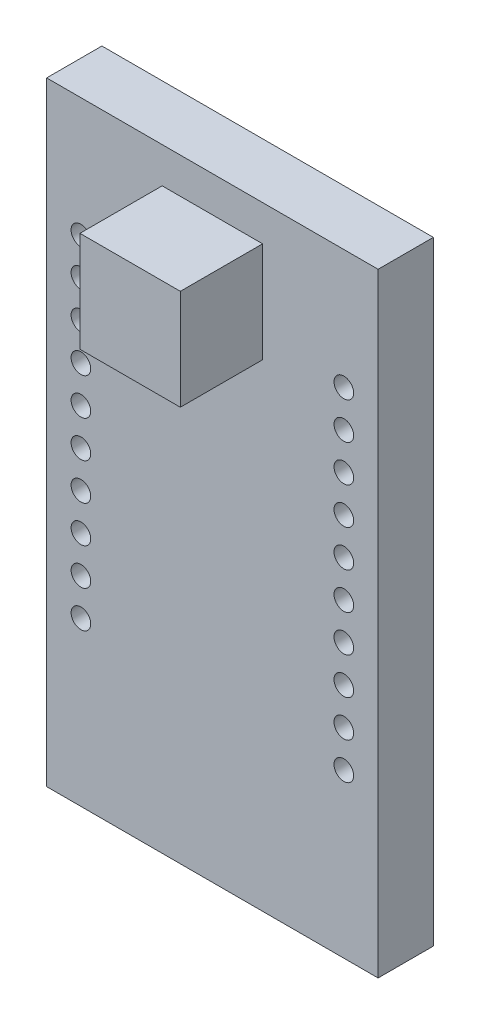
ISO-10303-21;
HEADER;
FILE_DESCRIPTION(('STEP AP214'),'2;1');
FILE_NAME('part.step','',(''),(''),'','','');
FILE_SCHEMA(('AUTOMOTIVE_DESIGN { 1 0 10303 214 1 1 1 1 }'));
ENDSEC;
DATA;
#1=APPLICATION_CONTEXT('core data for automotive mechanical design processes');
#2=APPLICATION_PROTOCOL_DEFINITION('international standard','automotive_design',2000,#1);
#3=PRODUCT_CONTEXT('',#1,'mechanical');
#4=PRODUCT('Part','Part','',(#3));
#5=PRODUCT_RELATED_PRODUCT_CATEGORY('part','',(#4));
#6=PRODUCT_DEFINITION_FORMATION('','',#4);
#7=PRODUCT_DEFINITION_CONTEXT('part definition',#1,'design');
#8=PRODUCT_DEFINITION('design','',#6,#7);
#9=PRODUCT_DEFINITION_SHAPE('','',#8);
#10=(LENGTH_UNIT() NAMED_UNIT(*) SI_UNIT(.MILLI.,.METRE.));
#11=(NAMED_UNIT(*) PLANE_ANGLE_UNIT() SI_UNIT($,.RADIAN.));
#12=(NAMED_UNIT(*) SI_UNIT($,.STERADIAN.) SOLID_ANGLE_UNIT());
#13=UNCERTAINTY_MEASURE_WITH_UNIT(LENGTH_MEASURE(1.E-05),#10,'distance_accuracy_value','');
#14=(GEOMETRIC_REPRESENTATION_CONTEXT(3) GLOBAL_UNCERTAINTY_ASSIGNED_CONTEXT((#13)) GLOBAL_UNIT_ASSIGNED_CONTEXT((#10,
#11,#12)) REPRESENTATION_CONTEXT('',''));
#15=CARTESIAN_POINT('',(0.,0.,0.));
#16=DIRECTION('',(0.,0.,1.));
#17=DIRECTION('',(1.,0.,0.));
#18=AXIS2_PLACEMENT_3D('',#15,#16,#17);
#19=CARTESIAN_POINT('',(0.,0.,4.5));
#20=DIRECTION('',(0.,0.,1.));
#21=DIRECTION('',(1.,0.,0.));
#22=AXIS2_PLACEMENT_3D('',#19,#20,#21);
#23=PLANE('',#22);
#24=CARTESIAN_POINT('',(-10.7092898997726,15.2710613434894,4.5));
#25=DIRECTION('',(0.,0.,-1.));
#26=DIRECTION('',(-1.,0.,0.));
#27=AXIS2_PLACEMENT_3D('',#24,#25,#26);
#28=CIRCLE('',#27,0.800000000000001);
#29=CARTESIAN_POINT('',(-11.5092898997726,15.2710613434894,4.5));
#30=VERTEX_POINT('',#29);
#31=EDGE_CURVE('E228',#30,#30,#28,.T.);
#32=ORIENTED_EDGE('',*,*,#31,.T.);
#33=EDGE_LOOP('',(#32));
#34=FACE_BOUND('',#33,.T.);
#35=CARTESIAN_POINT('',(-10.7092898997726,12.2710613434894,4.5));
#36=DIRECTION('',(0.,0.,-1.));
#37=DIRECTION('',(-1.,0.,0.));
#38=AXIS2_PLACEMENT_3D('',#35,#36,#37);
#39=CIRCLE('',#38,0.800000000000001);
#40=CARTESIAN_POINT('',(-11.5092898997726,12.2710613434894,4.5));
#41=VERTEX_POINT('',#40);
#42=EDGE_CURVE('E358',#41,#41,#39,.T.);
#43=ORIENTED_EDGE('',*,*,#42,.T.);
#44=EDGE_LOOP('',(#43));
#45=FACE_BOUND('',#44,.T.);
#46=CARTESIAN_POINT('',(-10.7092898997726,9.27106134348941,4.5));
#47=DIRECTION('',(0.,0.,-1.));
#48=DIRECTION('',(-1.,0.,0.));
#49=AXIS2_PLACEMENT_3D('',#46,#47,#48);
#50=CIRCLE('',#49,0.800000000000001);
#51=CARTESIAN_POINT('',(-11.5092898997726,9.27106134348941,4.5));
#52=VERTEX_POINT('',#51);
#53=EDGE_CURVE('E354',#52,#52,#50,.T.);
#54=ORIENTED_EDGE('',*,*,#53,.T.);
#55=EDGE_LOOP('',(#54));
#56=FACE_BOUND('',#55,.T.);
#57=CARTESIAN_POINT('',(-10.7092898997726,6.27106134348941,4.5));
#58=DIRECTION('',(0.,0.,-1.));
#59=DIRECTION('',(-1.,0.,0.));
#60=AXIS2_PLACEMENT_3D('',#57,#58,#59);
#61=CIRCLE('',#60,0.800000000000001);
#62=CARTESIAN_POINT('',(-11.5092898997726,6.27106134348941,4.5));
#63=VERTEX_POINT('',#62);
#64=EDGE_CURVE('E350',#63,#63,#61,.T.);
#65=ORIENTED_EDGE('',*,*,#64,.T.);
#66=EDGE_LOOP('',(#65));
#67=FACE_BOUND('',#66,.T.);
#68=CARTESIAN_POINT('',(-10.7092898997726,3.27106134348941,4.5));
#69=DIRECTION('',(0.,0.,-1.));
#70=DIRECTION('',(-1.,0.,0.));
#71=AXIS2_PLACEMENT_3D('',#68,#69,#70);
#72=CIRCLE('',#71,0.800000000000001);
#73=CARTESIAN_POINT('',(-11.5092898997726,3.27106134348941,4.5));
#74=VERTEX_POINT('',#73);
#75=EDGE_CURVE('E346',#74,#74,#72,.T.);
#76=ORIENTED_EDGE('',*,*,#75,.T.);
#77=EDGE_LOOP('',(#76));
#78=FACE_BOUND('',#77,.T.);
#79=CARTESIAN_POINT('',(-10.7092898997726,0.27106134348941,4.5));
#80=DIRECTION('',(0.,0.,-1.));
#81=DIRECTION('',(-1.,0.,0.));
#82=AXIS2_PLACEMENT_3D('',#79,#80,#81);
#83=CIRCLE('',#82,0.800000000000001);
#84=CARTESIAN_POINT('',(-11.5092898997726,0.27106134348941,4.5));
#85=VERTEX_POINT('',#84);
#86=EDGE_CURVE('E342',#85,#85,#83,.T.);
#87=ORIENTED_EDGE('',*,*,#86,.T.);
#88=EDGE_LOOP('',(#87));
#89=FACE_BOUND('',#88,.T.);
#90=CARTESIAN_POINT('',(-10.7092898997726,-2.72893865651059,4.5));
#91=DIRECTION('',(0.,0.,-1.));
#92=DIRECTION('',(-1.,0.,0.));
#93=AXIS2_PLACEMENT_3D('',#90,#91,#92);
#94=CIRCLE('',#93,0.800000000000001);
#95=CARTESIAN_POINT('',(-11.5092898997726,-2.72893865651059,4.5));
#96=VERTEX_POINT('',#95);
#97=EDGE_CURVE('E338',#96,#96,#94,.T.);
#98=ORIENTED_EDGE('',*,*,#97,.T.);
#99=EDGE_LOOP('',(#98));
#100=FACE_BOUND('',#99,.T.);
#101=CARTESIAN_POINT('',(-10.7092898997726,-5.72893865651059,4.5));
#102=DIRECTION('',(0.,0.,-1.));
#103=DIRECTION('',(-1.,0.,0.));
#104=AXIS2_PLACEMENT_3D('',#101,#102,#103);
#105=CIRCLE('',#104,0.800000000000001);
#106=CARTESIAN_POINT('',(-11.5092898997726,-5.72893865651059,4.5));
#107=VERTEX_POINT('',#106);
#108=EDGE_CURVE('E334',#107,#107,#105,.T.);
#109=ORIENTED_EDGE('',*,*,#108,.T.);
#110=EDGE_LOOP('',(#109));
#111=FACE_BOUND('',#110,.T.);
#112=CARTESIAN_POINT('',(-10.7092898997726,-8.72893865651059,4.5));
#113=DIRECTION('',(0.,0.,-1.));
#114=DIRECTION('',(-1.,0.,0.));
#115=AXIS2_PLACEMENT_3D('',#112,#113,#114);
#116=CIRCLE('',#115,0.800000000000001);
#117=CARTESIAN_POINT('',(-11.5092898997726,-8.72893865651059,4.5));
#118=VERTEX_POINT('',#117);
#119=EDGE_CURVE('E330',#118,#118,#116,.T.);
#120=ORIENTED_EDGE('',*,*,#119,.T.);
#121=EDGE_LOOP('',(#120));
#122=FACE_BOUND('',#121,.T.);
#123=CARTESIAN_POINT('',(-10.7092898997726,-11.7289386565106,4.5));
#124=DIRECTION('',(0.,0.,-1.));
#125=DIRECTION('',(-1.,0.,0.));
#126=AXIS2_PLACEMENT_3D('',#123,#124,#125);
#127=CIRCLE('',#126,0.800000000000001);
#128=CARTESIAN_POINT('',(-11.5092898997726,-11.7289386565106,4.5));
#129=VERTEX_POINT('',#128);
#130=EDGE_CURVE('E326',#129,#129,#127,.T.);
#131=ORIENTED_EDGE('',*,*,#130,.T.);
#132=EDGE_LOOP('',(#131));
#133=FACE_BOUND('',#132,.T.);
#134=CARTESIAN_POINT('',(10.7092898997726,15.2710613434894,4.5));
#135=DIRECTION('',(0.,0.,1.));
#136=DIRECTION('',(1.,0.,0.));
#137=AXIS2_PLACEMENT_3D('',#134,#135,#136);
#138=CIRCLE('',#137,0.800000000000001);
#139=CARTESIAN_POINT('',(11.5092898997726,15.2710613434894,4.5));
#140=VERTEX_POINT('',#139);
#141=EDGE_CURVE('E187',#140,#140,#138,.T.);
#142=ORIENTED_EDGE('',*,*,#141,.F.);
#143=EDGE_LOOP('',(#142));
#144=FACE_BOUND('',#143,.T.);
#145=CARTESIAN_POINT('',(10.7092898997726,12.2710613434894,4.5));
#146=DIRECTION('',(0.,0.,1.));
#147=DIRECTION('',(1.,0.,0.));
#148=AXIS2_PLACEMENT_3D('',#145,#146,#147);
#149=CIRCLE('',#148,0.800000000000001);
#150=CARTESIAN_POINT('',(11.5092898997726,12.2710613434894,4.5));
#151=VERTEX_POINT('',#150);
#152=EDGE_CURVE('E297',#151,#151,#149,.T.);
#153=ORIENTED_EDGE('',*,*,#152,.F.);
#154=EDGE_LOOP('',(#153));
#155=FACE_BOUND('',#154,.T.);
#156=CARTESIAN_POINT('',(10.7092898997726,9.27106134348941,4.5));
#157=DIRECTION('',(0.,0.,1.));
#158=DIRECTION('',(1.,0.,0.));
#159=AXIS2_PLACEMENT_3D('',#156,#157,#158);
#160=CIRCLE('',#159,0.800000000000001);
#161=CARTESIAN_POINT('',(11.5092898997726,9.27106134348941,4.5));
#162=VERTEX_POINT('',#161);
#163=EDGE_CURVE('E301',#162,#162,#160,.T.);
#164=ORIENTED_EDGE('',*,*,#163,.F.);
#165=EDGE_LOOP('',(#164));
#166=FACE_BOUND('',#165,.T.);
#167=CARTESIAN_POINT('',(10.7092898997726,6.27106134348941,4.5));
#168=DIRECTION('',(0.,0.,1.));
#169=DIRECTION('',(1.,0.,0.));
#170=AXIS2_PLACEMENT_3D('',#167,#168,#169);
#171=CIRCLE('',#170,0.800000000000001);
#172=CARTESIAN_POINT('',(11.5092898997726,6.27106134348941,4.5));
#173=VERTEX_POINT('',#172);
#174=EDGE_CURVE('E305',#173,#173,#171,.T.);
#175=ORIENTED_EDGE('',*,*,#174,.F.);
#176=EDGE_LOOP('',(#175));
#177=FACE_BOUND('',#176,.T.);
#178=CARTESIAN_POINT('',(10.7092898997726,3.27106134348941,4.5));
#179=DIRECTION('',(0.,0.,1.));
#180=DIRECTION('',(1.,0.,0.));
#181=AXIS2_PLACEMENT_3D('',#178,#179,#180);
#182=CIRCLE('',#181,0.800000000000001);
#183=CARTESIAN_POINT('',(11.5092898997726,3.27106134348941,4.5));
#184=VERTEX_POINT('',#183);
#185=EDGE_CURVE('E309',#184,#184,#182,.T.);
#186=ORIENTED_EDGE('',*,*,#185,.F.);
#187=EDGE_LOOP('',(#186));
#188=FACE_BOUND('',#187,.T.);
#189=CARTESIAN_POINT('',(10.7092898997726,0.27106134348941,4.5));
#190=DIRECTION('',(0.,0.,1.));
#191=DIRECTION('',(1.,0.,0.));
#192=AXIS2_PLACEMENT_3D('',#189,#190,#191);
#193=CIRCLE('',#192,0.800000000000001);
#194=CARTESIAN_POINT('',(11.5092898997726,0.27106134348941,4.5));
#195=VERTEX_POINT('',#194);
#196=EDGE_CURVE('E313',#195,#195,#193,.T.);
#197=ORIENTED_EDGE('',*,*,#196,.F.);
#198=EDGE_LOOP('',(#197));
#199=FACE_BOUND('',#198,.T.);
#200=CARTESIAN_POINT('',(10.7092898997726,-2.72893865651059,4.5));
#201=DIRECTION('',(0.,0.,1.));
#202=DIRECTION('',(1.,0.,0.));
#203=AXIS2_PLACEMENT_3D('',#200,#201,#202);
#204=CIRCLE('',#203,0.800000000000001);
#205=CARTESIAN_POINT('',(11.5092898997726,-2.72893865651059,4.5));
#206=VERTEX_POINT('',#205);
#207=EDGE_CURVE('E317',#206,#206,#204,.T.);
#208=ORIENTED_EDGE('',*,*,#207,.F.);
#209=EDGE_LOOP('',(#208));
#210=FACE_BOUND('',#209,.T.);
#211=CARTESIAN_POINT('',(10.7092898997726,-5.72893865651059,4.5));
#212=DIRECTION('',(0.,0.,1.));
#213=DIRECTION('',(1.,0.,0.));
#214=AXIS2_PLACEMENT_3D('',#211,#212,#213);
#215=CIRCLE('',#214,0.800000000000001);
#216=CARTESIAN_POINT('',(11.5092898997726,-5.72893865651059,4.5));
#217=VERTEX_POINT('',#216);
#218=EDGE_CURVE('E273',#217,#217,#215,.T.);
#219=ORIENTED_EDGE('',*,*,#218,.F.);
#220=EDGE_LOOP('',(#219));
#221=FACE_BOUND('',#220,.T.);
#222=CARTESIAN_POINT('',(10.7092898997726,-8.72893865651059,4.5));
#223=DIRECTION('',(0.,0.,1.));
#224=DIRECTION('',(1.,0.,0.));
#225=AXIS2_PLACEMENT_3D('',#222,#223,#224);
#226=CIRCLE('',#225,0.800000000000001);
#227=CARTESIAN_POINT('',(11.5092898997726,-8.72893865651059,4.5));
#228=VERTEX_POINT('',#227);
#229=EDGE_CURVE('E267',#228,#228,#226,.T.);
#230=ORIENTED_EDGE('',*,*,#229,.F.);
#231=EDGE_LOOP('',(#230));
#232=FACE_BOUND('',#231,.T.);
#233=CARTESIAN_POINT('',(10.7092898997726,-11.7289386565106,4.5));
#234=DIRECTION('',(0.,0.,1.));
#235=DIRECTION('',(1.,0.,0.));
#236=AXIS2_PLACEMENT_3D('',#233,#234,#235);
#237=CIRCLE('',#236,0.800000000000001);
#238=CARTESIAN_POINT('',(11.5092898997726,-11.7289386565106,4.5));
#239=VERTEX_POINT('',#238);
#240=EDGE_CURVE('E262',#239,#239,#237,.T.);
#241=ORIENTED_EDGE('',*,*,#240,.F.);
#242=EDGE_LOOP('',(#241));
#243=FACE_BOUND('',#242,.T.);
#244=DIRECTION('',(0.,1.,0.));
#245=VECTOR('',#244,1.);
#246=CARTESIAN_POINT('',(13.5,25.,4.5));
#247=LINE('',#246,#245);
#248=CARTESIAN_POINT('',(13.5,-25.,4.5));
#249=VERTEX_POINT('',#248);
#250=CARTESIAN_POINT('',(13.5,25.,4.5));
#251=VERTEX_POINT('',#250);
#252=EDGE_CURVE('E156',#249,#251,#247,.T.);
#253=ORIENTED_EDGE('',*,*,#252,.T.);
#254=DIRECTION('',(-1.,0.,0.));
#255=VECTOR('',#254,1.);
#256=CARTESIAN_POINT('',(-13.5,25.,4.5));
#257=LINE('',#256,#255);
#258=CARTESIAN_POINT('',(-13.5,25.,4.5));
#259=VERTEX_POINT('',#258);
#260=EDGE_CURVE('E96',#251,#259,#257,.T.);
#261=ORIENTED_EDGE('',*,*,#260,.T.);
#262=DIRECTION('',(0.,-1.,0.));
#263=VECTOR('',#262,1.);
#264=CARTESIAN_POINT('',(-13.5,25.,4.5));
#265=LINE('',#264,#263);
#266=CARTESIAN_POINT('',(-13.5,-25.,4.5));
#267=VERTEX_POINT('',#266);
#268=EDGE_CURVE('E161',#259,#267,#265,.T.);
#269=ORIENTED_EDGE('',*,*,#268,.T.);
#270=DIRECTION('',(1.,0.,0.));
#271=VECTOR('',#270,1.);
#272=CARTESIAN_POINT('',(-13.5,-25.,4.5));
#273=LINE('',#272,#271);
#274=EDGE_CURVE('E68',#267,#249,#273,.T.);
#275=ORIENTED_EDGE('',*,*,#274,.T.);
#276=EDGE_LOOP('',(#253,#261,#269,#275));
#277=FACE_BOUND('',#276,.T.);
#278=DIRECTION('',(-1.,0.,0.));
#279=VECTOR('',#278,1.);
#280=CARTESIAN_POINT('',(-4.09,22.09,4.5));
#281=LINE('',#280,#279);
#282=CARTESIAN_POINT('',(4.09,22.09,4.5));
#283=VERTEX_POINT('',#282);
#284=CARTESIAN_POINT('',(-4.09,22.09,4.5));
#285=VERTEX_POINT('',#284);
#286=EDGE_CURVE('E284',#283,#285,#281,.T.);
#287=ORIENTED_EDGE('',*,*,#286,.F.);
#288=DIRECTION('',(0.,1.,0.));
#289=VECTOR('',#288,1.);
#290=CARTESIAN_POINT('',(4.09,22.09,4.5));
#291=LINE('',#290,#289);
#292=CARTESIAN_POINT('',(4.09,13.91,4.5));
#293=VERTEX_POINT('',#292);
#294=EDGE_CURVE('E143',#293,#283,#291,.T.);
#295=ORIENTED_EDGE('',*,*,#294,.F.);
#296=DIRECTION('',(1.,0.,0.));
#297=VECTOR('',#296,1.);
#298=CARTESIAN_POINT('',(-4.09,13.91,4.5));
#299=LINE('',#298,#297);
#300=CARTESIAN_POINT('',(-4.09,13.91,4.5));
#301=VERTEX_POINT('',#300);
#302=EDGE_CURVE('E139',#301,#293,#299,.T.);
#303=ORIENTED_EDGE('',*,*,#302,.F.);
#304=DIRECTION('',(0.,-1.,0.));
#305=VECTOR('',#304,1.);
#306=CARTESIAN_POINT('',(-4.09,22.09,4.5));
#307=LINE('',#306,#305);
#308=EDGE_CURVE('E287',#285,#301,#307,.T.);
#309=ORIENTED_EDGE('',*,*,#308,.F.);
#310=EDGE_LOOP('',(#287,#295,#303,#309));
#311=FACE_BOUND('',#310,.T.);
#312=ADVANCED_FACE('F41',(#34,#45,#56,#67,#78,#89,#100,#111,#122,#133,#144,#155,#166,#177,#188,
#199,#210,#221,#232,#243,#277,#311),#23,.T.);
#313=CARTESIAN_POINT('',(13.5,25.,4.5));
#314=DIRECTION('',(-1.,0.,0.));
#315=DIRECTION('',(0.,-1.,0.));
#316=AXIS2_PLACEMENT_3D('',#313,#314,#315);
#317=PLANE('',#316);
#318=DIRECTION('',(0.,1.,0.));
#319=VECTOR('',#318,1.);
#320=CARTESIAN_POINT('',(13.5,25.,0.));
#321=LINE('',#320,#319);
#322=CARTESIAN_POINT('',(13.5,-25.,0.));
#323=VERTEX_POINT('',#322);
#324=CARTESIAN_POINT('',(13.5,25.,0.));
#325=VERTEX_POINT('',#324);
#326=EDGE_CURVE('E146',#323,#325,#321,.T.);
#327=ORIENTED_EDGE('',*,*,#326,.T.);
#328=DIRECTION('',(0.,0.,-1.));
#329=VECTOR('',#328,1.);
#330=CARTESIAN_POINT('',(13.5,25.,4.5));
#331=LINE('',#330,#329);
#332=EDGE_CURVE('E11',#251,#325,#331,.T.);
#333=ORIENTED_EDGE('',*,*,#332,.F.);
#334=ORIENTED_EDGE('',*,*,#252,.F.);
#335=DIRECTION('',(0.,0.,-1.));
#336=VECTOR('',#335,1.);
#337=CARTESIAN_POINT('',(13.5,-25.,4.5));
#338=LINE('',#337,#336);
#339=EDGE_CURVE('E165',#249,#323,#338,.T.);
#340=ORIENTED_EDGE('',*,*,#339,.T.);
#341=EDGE_LOOP('',(#327,#333,#334,#340));
#342=FACE_BOUND('',#341,.T.);
#343=ADVANCED_FACE('F43',(#342),#317,.F.);
#344=CARTESIAN_POINT('',(-13.5,25.,4.5));
#345=DIRECTION('',(0.,-1.,0.));
#346=DIRECTION('',(0.,0.,-1.));
#347=AXIS2_PLACEMENT_3D('',#344,#345,#346);
#348=PLANE('',#347);
#349=DIRECTION('',(-1.,0.,0.));
#350=VECTOR('',#349,1.);
#351=CARTESIAN_POINT('',(-13.5,25.,0.));
#352=LINE('',#351,#350);
#353=CARTESIAN_POINT('',(-13.5,25.,0.));
#354=VERTEX_POINT('',#353);
#355=EDGE_CURVE('E151',#325,#354,#352,.T.);
#356=ORIENTED_EDGE('',*,*,#355,.T.);
#357=DIRECTION('',(0.,0.,-1.));
#358=VECTOR('',#357,1.);
#359=CARTESIAN_POINT('',(-13.5,25.,4.5));
#360=LINE('',#359,#358);
#361=EDGE_CURVE('E51',#259,#354,#360,.T.);
#362=ORIENTED_EDGE('',*,*,#361,.F.);
#363=ORIENTED_EDGE('',*,*,#260,.F.);
#364=ORIENTED_EDGE('',*,*,#332,.T.);
#365=EDGE_LOOP('',(#356,#362,#363,#364));
#366=FACE_BOUND('',#365,.T.);
#367=ADVANCED_FACE('F383',(#366),#348,.F.);
#368=CARTESIAN_POINT('',(-13.5,25.,4.5));
#369=DIRECTION('',(1.,0.,0.));
#370=DIRECTION('',(0.,0.,-1.));
#371=AXIS2_PLACEMENT_3D('',#368,#369,#370);
#372=PLANE('',#371);
#373=DIRECTION('',(0.,-1.,0.));
#374=VECTOR('',#373,1.);
#375=CARTESIAN_POINT('',(-13.5,25.,0.));
#376=LINE('',#375,#374);
#377=CARTESIAN_POINT('',(-13.5,-25.,0.));
#378=VERTEX_POINT('',#377);
#379=EDGE_CURVE('E169',#354,#378,#376,.T.);
#380=ORIENTED_EDGE('',*,*,#379,.T.);
#381=DIRECTION('',(0.,0.,-1.));
#382=VECTOR('',#381,1.);
#383=CARTESIAN_POINT('',(-13.5,-25.,4.5));
#384=LINE('',#383,#382);
#385=EDGE_CURVE('E176',#267,#378,#384,.T.);
#386=ORIENTED_EDGE('',*,*,#385,.F.);
#387=ORIENTED_EDGE('',*,*,#268,.F.);
#388=ORIENTED_EDGE('',*,*,#361,.T.);
#389=EDGE_LOOP('',(#380,#386,#387,#388));
#390=FACE_BOUND('',#389,.T.);
#391=ADVANCED_FACE('F395',(#390),#372,.F.);
#392=CARTESIAN_POINT('',(-13.5,-25.,4.5));
#393=DIRECTION('',(0.,1.,0.));
#394=DIRECTION('',(0.,0.,1.));
#395=AXIS2_PLACEMENT_3D('',#392,#393,#394);
#396=PLANE('',#395);
#397=DIRECTION('',(1.,0.,0.));
#398=VECTOR('',#397,1.);
#399=CARTESIAN_POINT('',(-13.5,-25.,0.));
#400=LINE('',#399,#398);
#401=EDGE_CURVE('E89',#378,#323,#400,.T.);
#402=ORIENTED_EDGE('',*,*,#401,.T.);
#403=ORIENTED_EDGE('',*,*,#339,.F.);
#404=ORIENTED_EDGE('',*,*,#274,.F.);
#405=ORIENTED_EDGE('',*,*,#385,.T.);
#406=EDGE_LOOP('',(#402,#403,#404,#405));
#407=FACE_BOUND('',#406,.T.);
#408=ADVANCED_FACE('F391',(#407),#396,.F.);
#409=CARTESIAN_POINT('',(0.,0.,0.));
#410=DIRECTION('',(0.,0.,1.));
#411=DIRECTION('',(1.,0.,0.));
#412=AXIS2_PLACEMENT_3D('',#409,#410,#411);
#413=PLANE('',#412);
#414=CARTESIAN_POINT('',(-10.7092898997726,15.2710613434894,0.));
#415=DIRECTION('',(0.,0.,1.));
#416=DIRECTION('',(1.,0.,0.));
#417=AXIS2_PLACEMENT_3D('',#414,#415,#416);
#418=CIRCLE('',#417,0.800000000000001);
#419=CARTESIAN_POINT('',(-9.90928989977261,15.2710613434894,0.));
#420=VERTEX_POINT('',#419);
#421=EDGE_CURVE('E45',#420,#420,#418,.F.);
#422=ORIENTED_EDGE('',*,*,#421,.F.);
#423=EDGE_LOOP('',(#422));
#424=FACE_BOUND('',#423,.T.);
#425=CARTESIAN_POINT('',(-10.7092898997726,12.2710613434894,0.));
#426=DIRECTION('',(0.,0.,1.));
#427=DIRECTION('',(1.,0.,0.));
#428=AXIS2_PLACEMENT_3D('',#425,#426,#427);
#429=CIRCLE('',#428,0.800000000000001);
#430=CARTESIAN_POINT('',(-9.90928989977261,12.2710613434894,0.));
#431=VERTEX_POINT('',#430);
#432=EDGE_CURVE('E255',#431,#431,#429,.F.);
#433=ORIENTED_EDGE('',*,*,#432,.F.);
#434=EDGE_LOOP('',(#433));
#435=FACE_BOUND('',#434,.T.);
#436=CARTESIAN_POINT('',(-10.7092898997726,9.27106134348941,0.));
#437=DIRECTION('',(0.,0.,1.));
#438=DIRECTION('',(1.,0.,0.));
#439=AXIS2_PLACEMENT_3D('',#436,#437,#438);
#440=CIRCLE('',#439,0.800000000000001);
#441=CARTESIAN_POINT('',(-9.90928989977262,9.27106134348941,0.));
#442=VERTEX_POINT('',#441);
#443=EDGE_CURVE('E252',#442,#442,#440,.F.);
#444=ORIENTED_EDGE('',*,*,#443,.F.);
#445=EDGE_LOOP('',(#444));
#446=FACE_BOUND('',#445,.T.);
#447=CARTESIAN_POINT('',(-10.7092898997726,6.27106134348941,0.));
#448=DIRECTION('',(0.,0.,1.));
#449=DIRECTION('',(1.,0.,0.));
#450=AXIS2_PLACEMENT_3D('',#447,#448,#449);
#451=CIRCLE('',#450,0.800000000000001);
#452=CARTESIAN_POINT('',(-9.90928989977262,6.27106134348941,0.));
#453=VERTEX_POINT('',#452);
#454=EDGE_CURVE('E248',#453,#453,#451,.F.);
#455=ORIENTED_EDGE('',*,*,#454,.F.);
#456=EDGE_LOOP('',(#455));
#457=FACE_BOUND('',#456,.T.);
#458=CARTESIAN_POINT('',(-10.7092898997726,3.27106134348941,0.));
#459=DIRECTION('',(0.,0.,1.));
#460=DIRECTION('',(1.,0.,0.));
#461=AXIS2_PLACEMENT_3D('',#458,#459,#460);
#462=CIRCLE('',#461,0.800000000000001);
#463=CARTESIAN_POINT('',(-9.90928989977262,3.27106134348941,0.));
#464=VERTEX_POINT('',#463);
#465=EDGE_CURVE('E244',#464,#464,#462,.F.);
#466=ORIENTED_EDGE('',*,*,#465,.F.);
#467=EDGE_LOOP('',(#466));
#468=FACE_BOUND('',#467,.T.);
#469=CARTESIAN_POINT('',(-10.7092898997726,0.27106134348941,0.));
#470=DIRECTION('',(0.,0.,1.));
#471=DIRECTION('',(1.,0.,0.));
#472=AXIS2_PLACEMENT_3D('',#469,#470,#471);
#473=CIRCLE('',#472,0.800000000000001);
#474=CARTESIAN_POINT('',(-9.90928989977262,0.27106134348941,0.));
#475=VERTEX_POINT('',#474);
#476=EDGE_CURVE('E240',#475,#475,#473,.F.);
#477=ORIENTED_EDGE('',*,*,#476,.F.);
#478=EDGE_LOOP('',(#477));
#479=FACE_BOUND('',#478,.T.);
#480=CARTESIAN_POINT('',(-10.7092898997726,-2.72893865651059,0.));
#481=DIRECTION('',(0.,0.,1.));
#482=DIRECTION('',(1.,0.,0.));
#483=AXIS2_PLACEMENT_3D('',#480,#481,#482);
#484=CIRCLE('',#483,0.800000000000001);
#485=CARTESIAN_POINT('',(-9.90928989977262,-2.72893865651059,0.));
#486=VERTEX_POINT('',#485);
#487=EDGE_CURVE('E236',#486,#486,#484,.F.);
#488=ORIENTED_EDGE('',*,*,#487,.F.);
#489=EDGE_LOOP('',(#488));
#490=FACE_BOUND('',#489,.T.);
#491=CARTESIAN_POINT('',(-10.7092898997726,-5.72893865651059,0.));
#492=DIRECTION('',(0.,0.,1.));
#493=DIRECTION('',(1.,0.,0.));
#494=AXIS2_PLACEMENT_3D('',#491,#492,#493);
#495=CIRCLE('',#494,0.800000000000001);
#496=CARTESIAN_POINT('',(-9.90928989977262,-5.72893865651059,0.));
#497=VERTEX_POINT('',#496);
#498=EDGE_CURVE('E232',#497,#497,#495,.F.);
#499=ORIENTED_EDGE('',*,*,#498,.F.);
#500=EDGE_LOOP('',(#499));
#501=FACE_BOUND('',#500,.T.);
#502=CARTESIAN_POINT('',(-10.7092898997726,-8.72893865651059,0.));
#503=DIRECTION('',(0.,0.,1.));
#504=DIRECTION('',(1.,0.,0.));
#505=AXIS2_PLACEMENT_3D('',#502,#503,#504);
#506=CIRCLE('',#505,0.800000000000001);
#507=CARTESIAN_POINT('',(-9.90928989977263,-8.72893865651059,0.));
#508=VERTEX_POINT('',#507);
#509=EDGE_CURVE('E227',#508,#508,#506,.F.);
#510=ORIENTED_EDGE('',*,*,#509,.F.);
#511=EDGE_LOOP('',(#510));
#512=FACE_BOUND('',#511,.T.);
#513=CARTESIAN_POINT('',(-10.7092898997726,-11.7289386565106,0.));
#514=DIRECTION('',(0.,0.,1.));
#515=DIRECTION('',(1.,0.,0.));
#516=AXIS2_PLACEMENT_3D('',#513,#514,#515);
#517=CIRCLE('',#516,0.800000000000001);
#518=CARTESIAN_POINT('',(-9.90928989977263,-11.7289386565106,0.));
#519=VERTEX_POINT('',#518);
#520=EDGE_CURVE('E223',#519,#519,#517,.F.);
#521=ORIENTED_EDGE('',*,*,#520,.F.);
#522=EDGE_LOOP('',(#521));
#523=FACE_BOUND('',#522,.T.);
#524=CARTESIAN_POINT('',(10.7092898997726,15.2710613434894,0.));
#525=DIRECTION('',(0.,0.,1.));
#526=DIRECTION('',(1.,0.,0.));
#527=AXIS2_PLACEMENT_3D('',#524,#525,#526);
#528=CIRCLE('',#527,0.800000000000001);
#529=CARTESIAN_POINT('',(11.5092898997726,15.2710613434894,0.));
#530=VERTEX_POINT('',#529);
#531=EDGE_CURVE('E219',#530,#530,#528,.T.);
#532=ORIENTED_EDGE('',*,*,#531,.T.);
#533=EDGE_LOOP('',(#532));
#534=FACE_BOUND('',#533,.T.);
#535=CARTESIAN_POINT('',(10.7092898997726,12.2710613434894,0.));
#536=DIRECTION('',(0.,0.,1.));
#537=DIRECTION('',(1.,0.,0.));
#538=AXIS2_PLACEMENT_3D('',#535,#536,#537);
#539=CIRCLE('',#538,0.800000000000001);
#540=CARTESIAN_POINT('',(11.5092898997726,12.2710613434894,0.));
#541=VERTEX_POINT('',#540);
#542=EDGE_CURVE('E215',#541,#541,#539,.T.);
#543=ORIENTED_EDGE('',*,*,#542,.T.);
#544=EDGE_LOOP('',(#543));
#545=FACE_BOUND('',#544,.T.);
#546=CARTESIAN_POINT('',(10.7092898997726,9.27106134348941,0.));
#547=DIRECTION('',(0.,0.,1.));
#548=DIRECTION('',(1.,0.,0.));
#549=AXIS2_PLACEMENT_3D('',#546,#547,#548);
#550=CIRCLE('',#549,0.800000000000001);
#551=CARTESIAN_POINT('',(11.5092898997726,9.27106134348941,0.));
#552=VERTEX_POINT('',#551);
#553=EDGE_CURVE('E211',#552,#552,#550,.T.);
#554=ORIENTED_EDGE('',*,*,#553,.T.);
#555=EDGE_LOOP('',(#554));
#556=FACE_BOUND('',#555,.T.);
#557=CARTESIAN_POINT('',(10.7092898997726,6.27106134348941,0.));
#558=DIRECTION('',(0.,0.,1.));
#559=DIRECTION('',(1.,0.,0.));
#560=AXIS2_PLACEMENT_3D('',#557,#558,#559);
#561=CIRCLE('',#560,0.800000000000001);
#562=CARTESIAN_POINT('',(11.5092898997726,6.27106134348941,0.));
#563=VERTEX_POINT('',#562);
#564=EDGE_CURVE('E207',#563,#563,#561,.T.);
#565=ORIENTED_EDGE('',*,*,#564,.T.);
#566=EDGE_LOOP('',(#565));
#567=FACE_BOUND('',#566,.T.);
#568=CARTESIAN_POINT('',(10.7092898997726,3.27106134348941,0.));
#569=DIRECTION('',(0.,0.,1.));
#570=DIRECTION('',(1.,0.,0.));
#571=AXIS2_PLACEMENT_3D('',#568,#569,#570);
#572=CIRCLE('',#571,0.800000000000001);
#573=CARTESIAN_POINT('',(11.5092898997726,3.27106134348941,0.));
#574=VERTEX_POINT('',#573);
#575=EDGE_CURVE('E203',#574,#574,#572,.T.);
#576=ORIENTED_EDGE('',*,*,#575,.T.);
#577=EDGE_LOOP('',(#576));
#578=FACE_BOUND('',#577,.T.);
#579=CARTESIAN_POINT('',(10.7092898997726,0.27106134348941,0.));
#580=DIRECTION('',(0.,0.,1.));
#581=DIRECTION('',(1.,0.,0.));
#582=AXIS2_PLACEMENT_3D('',#579,#580,#581);
#583=CIRCLE('',#582,0.800000000000001);
#584=CARTESIAN_POINT('',(11.5092898997726,0.27106134348941,0.));
#585=VERTEX_POINT('',#584);
#586=EDGE_CURVE('E199',#585,#585,#583,.T.);
#587=ORIENTED_EDGE('',*,*,#586,.T.);
#588=EDGE_LOOP('',(#587));
#589=FACE_BOUND('',#588,.T.);
#590=CARTESIAN_POINT('',(10.7092898997726,-2.72893865651059,0.));
#591=DIRECTION('',(0.,0.,1.));
#592=DIRECTION('',(1.,0.,0.));
#593=AXIS2_PLACEMENT_3D('',#590,#591,#592);
#594=CIRCLE('',#593,0.800000000000001);
#595=CARTESIAN_POINT('',(11.5092898997726,-2.72893865651059,0.));
#596=VERTEX_POINT('',#595);
#597=EDGE_CURVE('E195',#596,#596,#594,.T.);
#598=ORIENTED_EDGE('',*,*,#597,.T.);
#599=EDGE_LOOP('',(#598));
#600=FACE_BOUND('',#599,.T.);
#601=CARTESIAN_POINT('',(10.7092898997726,-5.72893865651059,0.));
#602=DIRECTION('',(0.,0.,1.));
#603=DIRECTION('',(1.,0.,0.));
#604=AXIS2_PLACEMENT_3D('',#601,#602,#603);
#605=CIRCLE('',#604,0.800000000000001);
#606=CARTESIAN_POINT('',(11.5092898997726,-5.72893865651059,0.));
#607=VERTEX_POINT('',#606);
#608=EDGE_CURVE('E191',#607,#607,#605,.T.);
#609=ORIENTED_EDGE('',*,*,#608,.T.);
#610=EDGE_LOOP('',(#609));
#611=FACE_BOUND('',#610,.T.);
#612=CARTESIAN_POINT('',(10.7092898997726,-8.72893865651059,0.));
#613=DIRECTION('',(0.,0.,1.));
#614=DIRECTION('',(1.,0.,0.));
#615=AXIS2_PLACEMENT_3D('',#612,#613,#614);
#616=CIRCLE('',#615,0.800000000000001);
#617=CARTESIAN_POINT('',(11.5092898997726,-8.72893865651059,0.));
#618=VERTEX_POINT('',#617);
#619=EDGE_CURVE('E186',#618,#618,#616,.T.);
#620=ORIENTED_EDGE('',*,*,#619,.T.);
#621=EDGE_LOOP('',(#620));
#622=FACE_BOUND('',#621,.T.);
#623=CARTESIAN_POINT('',(10.7092898997726,-11.7289386565106,0.));
#624=DIRECTION('',(0.,0.,1.));
#625=DIRECTION('',(1.,0.,0.));
#626=AXIS2_PLACEMENT_3D('',#623,#624,#625);
#627=CIRCLE('',#626,0.800000000000001);
#628=CARTESIAN_POINT('',(11.5092898997726,-11.7289386565106,0.));
#629=VERTEX_POINT('',#628);
#630=EDGE_CURVE('E182',#629,#629,#627,.T.);
#631=ORIENTED_EDGE('',*,*,#630,.T.);
#632=EDGE_LOOP('',(#631));
#633=FACE_BOUND('',#632,.T.);
#634=ORIENTED_EDGE('',*,*,#326,.F.);
#635=ORIENTED_EDGE('',*,*,#401,.F.);
#636=ORIENTED_EDGE('',*,*,#379,.F.);
#637=ORIENTED_EDGE('',*,*,#355,.F.);
#638=EDGE_LOOP('',(#634,#635,#636,#637));
#639=FACE_BOUND('',#638,.T.);
#640=ADVANCED_FACE('F388',(#424,#435,#446,#457,#468,#479,#490,#501,#512,#523,#534,#545,#556,
#567,#578,#589,#600,#611,#622,#633,#639),#413,.F.);
#641=CARTESIAN_POINT('',(4.09,22.09,11.2));
#642=DIRECTION('',(-1.,0.,0.));
#643=DIRECTION('',(0.,-1.,0.));
#644=AXIS2_PLACEMENT_3D('',#641,#642,#643);
#645=PLANE('',#644);
#646=ORIENTED_EDGE('',*,*,#294,.T.);
#647=DIRECTION('',(0.,0.,-1.));
#648=VECTOR('',#647,1.);
#649=CARTESIAN_POINT('',(4.09,22.09,11.2));
#650=LINE('',#649,#648);
#651=CARTESIAN_POINT('',(4.09,22.09,11.2));
#652=VERTEX_POINT('',#651);
#653=EDGE_CURVE('E122',#652,#283,#650,.T.);
#654=ORIENTED_EDGE('',*,*,#653,.F.);
#655=DIRECTION('',(0.,1.,0.));
#656=VECTOR('',#655,1.);
#657=CARTESIAN_POINT('',(4.09,22.09,11.2));
#658=LINE('',#657,#656);
#659=CARTESIAN_POINT('',(4.09,13.91,11.2));
#660=VERTEX_POINT('',#659);
#661=EDGE_CURVE('E130',#660,#652,#658,.T.);
#662=ORIENTED_EDGE('',*,*,#661,.F.);
#663=DIRECTION('',(0.,0.,-1.));
#664=VECTOR('',#663,1.);
#665=CARTESIAN_POINT('',(4.09,13.91,11.2));
#666=LINE('',#665,#664);
#667=EDGE_CURVE('E281',#660,#293,#666,.T.);
#668=ORIENTED_EDGE('',*,*,#667,.T.);
#669=EDGE_LOOP('',(#646,#654,#662,#668));
#670=FACE_BOUND('',#669,.T.);
#671=ADVANCED_FACE('F141',(#670),#645,.F.);
#672=CARTESIAN_POINT('',(-4.09,22.09,11.2));
#673=DIRECTION('',(0.,-1.,0.));
#674=DIRECTION('',(0.,0.,-1.));
#675=AXIS2_PLACEMENT_3D('',#672,#673,#674);
#676=PLANE('',#675);
#677=ORIENTED_EDGE('',*,*,#286,.T.);
#678=DIRECTION('',(0.,0.,-1.));
#679=VECTOR('',#678,1.);
#680=CARTESIAN_POINT('',(-4.09,22.09,11.2));
#681=LINE('',#680,#679);
#682=CARTESIAN_POINT('',(-4.09,22.09,11.2));
#683=VERTEX_POINT('',#682);
#684=EDGE_CURVE('E125',#683,#285,#681,.T.);
#685=ORIENTED_EDGE('',*,*,#684,.F.);
#686=DIRECTION('',(-1.,0.,0.));
#687=VECTOR('',#686,1.);
#688=CARTESIAN_POINT('',(-4.09,22.09,11.2));
#689=LINE('',#688,#687);
#690=EDGE_CURVE('E118',#652,#683,#689,.T.);
#691=ORIENTED_EDGE('',*,*,#690,.F.);
#692=ORIENTED_EDGE('',*,*,#653,.T.);
#693=EDGE_LOOP('',(#677,#685,#691,#692));
#694=FACE_BOUND('',#693,.T.);
#695=ADVANCED_FACE('F120',(#694),#676,.F.);
#696=CARTESIAN_POINT('',(-4.09,22.09,11.2));
#697=DIRECTION('',(1.,0.,0.));
#698=DIRECTION('',(0.,1.,0.));
#699=AXIS2_PLACEMENT_3D('',#696,#697,#698);
#700=PLANE('',#699);
#701=ORIENTED_EDGE('',*,*,#308,.T.);
#702=DIRECTION('',(0.,0.,-1.));
#703=VECTOR('',#702,1.);
#704=CARTESIAN_POINT('',(-4.09,13.91,11.2));
#705=LINE('',#704,#703);
#706=CARTESIAN_POINT('',(-4.09,13.91,11.2));
#707=VERTEX_POINT('',#706);
#708=EDGE_CURVE('E59',#707,#301,#705,.T.);
#709=ORIENTED_EDGE('',*,*,#708,.F.);
#710=DIRECTION('',(0.,-1.,0.));
#711=VECTOR('',#710,1.);
#712=CARTESIAN_POINT('',(-4.09,22.09,11.2));
#713=LINE('',#712,#711);
#714=EDGE_CURVE('E129',#683,#707,#713,.T.);
#715=ORIENTED_EDGE('',*,*,#714,.F.);
#716=ORIENTED_EDGE('',*,*,#684,.T.);
#717=EDGE_LOOP('',(#701,#709,#715,#716));
#718=FACE_BOUND('',#717,.T.);
#719=ADVANCED_FACE('F412',(#718),#700,.F.);
#720=CARTESIAN_POINT('',(-4.09,13.91,11.2));
#721=DIRECTION('',(0.,1.,0.));
#722=DIRECTION('',(0.,0.,1.));
#723=AXIS2_PLACEMENT_3D('',#720,#721,#722);
#724=PLANE('',#723);
#725=ORIENTED_EDGE('',*,*,#302,.T.);
#726=ORIENTED_EDGE('',*,*,#667,.F.);
#727=DIRECTION('',(1.,0.,0.));
#728=VECTOR('',#727,1.);
#729=CARTESIAN_POINT('',(-4.09,13.91,11.2));
#730=LINE('',#729,#728);
#731=EDGE_CURVE('E134',#707,#660,#730,.T.);
#732=ORIENTED_EDGE('',*,*,#731,.F.);
#733=ORIENTED_EDGE('',*,*,#708,.T.);
#734=EDGE_LOOP('',(#725,#726,#732,#733));
#735=FACE_BOUND('',#734,.T.);
#736=ADVANCED_FACE('F413',(#735),#724,.F.);
#737=CARTESIAN_POINT('',(0.,0.,11.2));
#738=DIRECTION('',(0.,0.,1.));
#739=DIRECTION('',(1.,0.,0.));
#740=AXIS2_PLACEMENT_3D('',#737,#738,#739);
#741=PLANE('',#740);
#742=ORIENTED_EDGE('',*,*,#661,.T.);
#743=ORIENTED_EDGE('',*,*,#690,.T.);
#744=ORIENTED_EDGE('',*,*,#714,.T.);
#745=ORIENTED_EDGE('',*,*,#731,.T.);
#746=EDGE_LOOP('',(#742,#743,#744,#745));
#747=FACE_BOUND('',#746,.T.);
#748=ADVANCED_FACE('F133',(#747),#741,.T.);
#749=CARTESIAN_POINT('',(10.7092898997726,-11.7289386565106,-2.2));
#750=DIRECTION('',(0.,0.,1.));
#751=DIRECTION('',(1.,0.,0.));
#752=AXIS2_PLACEMENT_3D('',#749,#750,#751);
#753=CYLINDRICAL_SURFACE('',#752,0.800000000000001);
#754=ORIENTED_EDGE('',*,*,#240,.T.);
#755=EDGE_LOOP('',(#754));
#756=FACE_BOUND('',#755,.T.);
#757=ORIENTED_EDGE('',*,*,#630,.F.);
#758=EDGE_LOOP('',(#757));
#759=FACE_BOUND('',#758,.T.);
#760=ADVANCED_FACE('F420',(#756,#759),#753,.F.);
#761=CARTESIAN_POINT('',(10.7092898997726,-8.72893865651059,-2.2));
#762=DIRECTION('',(0.,0.,1.));
#763=DIRECTION('',(1.,0.,0.));
#764=AXIS2_PLACEMENT_3D('',#761,#762,#763);
#765=CYLINDRICAL_SURFACE('',#764,0.800000000000001);
#766=ORIENTED_EDGE('',*,*,#229,.T.);
#767=EDGE_LOOP('',(#766));
#768=FACE_BOUND('',#767,.T.);
#769=ORIENTED_EDGE('',*,*,#619,.F.);
#770=EDGE_LOOP('',(#769));
#771=FACE_BOUND('',#770,.T.);
#772=ADVANCED_FACE('F493',(#768,#771),#765,.F.);
#773=CARTESIAN_POINT('',(10.7092898997726,-5.72893865651059,-2.2));
#774=DIRECTION('',(0.,0.,1.));
#775=DIRECTION('',(1.,0.,0.));
#776=AXIS2_PLACEMENT_3D('',#773,#774,#775);
#777=CYLINDRICAL_SURFACE('',#776,0.800000000000001);
#778=ORIENTED_EDGE('',*,*,#218,.T.);
#779=EDGE_LOOP('',(#778));
#780=FACE_BOUND('',#779,.T.);
#781=ORIENTED_EDGE('',*,*,#608,.F.);
#782=EDGE_LOOP('',(#781));
#783=FACE_BOUND('',#782,.T.);
#784=ADVANCED_FACE('F500',(#780,#783),#777,.F.);
#785=CARTESIAN_POINT('',(10.7092898997726,-2.72893865651059,-2.2));
#786=DIRECTION('',(0.,0.,1.));
#787=DIRECTION('',(1.,0.,0.));
#788=AXIS2_PLACEMENT_3D('',#785,#786,#787);
#789=CYLINDRICAL_SURFACE('',#788,0.800000000000001);
#790=ORIENTED_EDGE('',*,*,#207,.T.);
#791=EDGE_LOOP('',(#790));
#792=FACE_BOUND('',#791,.T.);
#793=ORIENTED_EDGE('',*,*,#597,.F.);
#794=EDGE_LOOP('',(#793));
#795=FACE_BOUND('',#794,.T.);
#796=ADVANCED_FACE('F509',(#792,#795),#789,.F.);
#797=CARTESIAN_POINT('',(10.7092898997726,0.27106134348941,-2.2));
#798=DIRECTION('',(0.,0.,1.));
#799=DIRECTION('',(1.,0.,0.));
#800=AXIS2_PLACEMENT_3D('',#797,#798,#799);
#801=CYLINDRICAL_SURFACE('',#800,0.800000000000001);
#802=ORIENTED_EDGE('',*,*,#196,.T.);
#803=EDGE_LOOP('',(#802));
#804=FACE_BOUND('',#803,.T.);
#805=ORIENTED_EDGE('',*,*,#586,.F.);
#806=EDGE_LOOP('',(#805));
#807=FACE_BOUND('',#806,.T.);
#808=ADVANCED_FACE('F517',(#804,#807),#801,.F.);
#809=CARTESIAN_POINT('',(10.7092898997726,3.27106134348941,-2.2));
#810=DIRECTION('',(0.,0.,1.));
#811=DIRECTION('',(1.,0.,0.));
#812=AXIS2_PLACEMENT_3D('',#809,#810,#811);
#813=CYLINDRICAL_SURFACE('',#812,0.800000000000001);
#814=ORIENTED_EDGE('',*,*,#185,.T.);
#815=EDGE_LOOP('',(#814));
#816=FACE_BOUND('',#815,.T.);
#817=ORIENTED_EDGE('',*,*,#575,.F.);
#818=EDGE_LOOP('',(#817));
#819=FACE_BOUND('',#818,.T.);
#820=ADVANCED_FACE('F526',(#816,#819),#813,.F.);
#821=CARTESIAN_POINT('',(10.7092898997726,6.27106134348941,-2.2));
#822=DIRECTION('',(0.,0.,1.));
#823=DIRECTION('',(1.,0.,0.));
#824=AXIS2_PLACEMENT_3D('',#821,#822,#823);
#825=CYLINDRICAL_SURFACE('',#824,0.800000000000001);
#826=ORIENTED_EDGE('',*,*,#174,.T.);
#827=EDGE_LOOP('',(#826));
#828=FACE_BOUND('',#827,.T.);
#829=ORIENTED_EDGE('',*,*,#564,.F.);
#830=EDGE_LOOP('',(#829));
#831=FACE_BOUND('',#830,.T.);
#832=ADVANCED_FACE('F535',(#828,#831),#825,.F.);
#833=CARTESIAN_POINT('',(10.7092898997726,9.27106134348941,-2.2));
#834=DIRECTION('',(0.,0.,1.));
#835=DIRECTION('',(1.,0.,0.));
#836=AXIS2_PLACEMENT_3D('',#833,#834,#835);
#837=CYLINDRICAL_SURFACE('',#836,0.800000000000001);
#838=ORIENTED_EDGE('',*,*,#163,.T.);
#839=EDGE_LOOP('',(#838));
#840=FACE_BOUND('',#839,.T.);
#841=ORIENTED_EDGE('',*,*,#553,.F.);
#842=EDGE_LOOP('',(#841));
#843=FACE_BOUND('',#842,.T.);
#844=ADVANCED_FACE('F544',(#840,#843),#837,.F.);
#845=CARTESIAN_POINT('',(10.7092898997726,12.2710613434894,-2.2));
#846=DIRECTION('',(0.,0.,1.));
#847=DIRECTION('',(1.,0.,0.));
#848=AXIS2_PLACEMENT_3D('',#845,#846,#847);
#849=CYLINDRICAL_SURFACE('',#848,0.800000000000001);
#850=ORIENTED_EDGE('',*,*,#152,.T.);
#851=EDGE_LOOP('',(#850));
#852=FACE_BOUND('',#851,.T.);
#853=ORIENTED_EDGE('',*,*,#542,.F.);
#854=EDGE_LOOP('',(#853));
#855=FACE_BOUND('',#854,.T.);
#856=ADVANCED_FACE('F553',(#852,#855),#849,.F.);
#857=CARTESIAN_POINT('',(10.7092898997726,15.2710613434894,-2.2));
#858=DIRECTION('',(0.,0.,1.));
#859=DIRECTION('',(1.,0.,0.));
#860=AXIS2_PLACEMENT_3D('',#857,#858,#859);
#861=CYLINDRICAL_SURFACE('',#860,0.800000000000001);
#862=ORIENTED_EDGE('',*,*,#141,.T.);
#863=EDGE_LOOP('',(#862));
#864=FACE_BOUND('',#863,.T.);
#865=ORIENTED_EDGE('',*,*,#531,.F.);
#866=EDGE_LOOP('',(#865));
#867=FACE_BOUND('',#866,.T.);
#868=ADVANCED_FACE('F562',(#864,#867),#861,.F.);
#869=CARTESIAN_POINT('',(-10.7092898997726,-11.7289386565106,-2.2));
#870=DIRECTION('',(0.,0.,1.));
#871=DIRECTION('',(1.,0.,0.));
#872=AXIS2_PLACEMENT_3D('',#869,#870,#871);
#873=CYLINDRICAL_SURFACE('',#872,0.800000000000001);
#874=ORIENTED_EDGE('',*,*,#130,.F.);
#875=EDGE_LOOP('',(#874));
#876=FACE_BOUND('',#875,.T.);
#877=ORIENTED_EDGE('',*,*,#520,.T.);
#878=EDGE_LOOP('',(#877));
#879=FACE_BOUND('',#878,.T.);
#880=ADVANCED_FACE('F570',(#876,#879),#873,.F.);
#881=CARTESIAN_POINT('',(-10.7092898997726,-8.72893865651059,-2.2));
#882=DIRECTION('',(0.,0.,1.));
#883=DIRECTION('',(1.,0.,0.));
#884=AXIS2_PLACEMENT_3D('',#881,#882,#883);
#885=CYLINDRICAL_SURFACE('',#884,0.800000000000001);
#886=ORIENTED_EDGE('',*,*,#119,.F.);
#887=EDGE_LOOP('',(#886));
#888=FACE_BOUND('',#887,.T.);
#889=ORIENTED_EDGE('',*,*,#509,.T.);
#890=EDGE_LOOP('',(#889));
#891=FACE_BOUND('',#890,.T.);
#892=ADVANCED_FACE('F578',(#888,#891),#885,.F.);
#893=CARTESIAN_POINT('',(-10.7092898997726,-5.72893865651059,-2.2));
#894=DIRECTION('',(0.,0.,1.));
#895=DIRECTION('',(1.,0.,0.));
#896=AXIS2_PLACEMENT_3D('',#893,#894,#895);
#897=CYLINDRICAL_SURFACE('',#896,0.800000000000001);
#898=ORIENTED_EDGE('',*,*,#108,.F.);
#899=EDGE_LOOP('',(#898));
#900=FACE_BOUND('',#899,.T.);
#901=ORIENTED_EDGE('',*,*,#498,.T.);
#902=EDGE_LOOP('',(#901));
#903=FACE_BOUND('',#902,.T.);
#904=ADVANCED_FACE('F587',(#900,#903),#897,.F.);
#905=CARTESIAN_POINT('',(-10.7092898997726,-2.72893865651059,-2.2));
#906=DIRECTION('',(0.,0.,1.));
#907=DIRECTION('',(1.,0.,0.));
#908=AXIS2_PLACEMENT_3D('',#905,#906,#907);
#909=CYLINDRICAL_SURFACE('',#908,0.800000000000001);
#910=ORIENTED_EDGE('',*,*,#97,.F.);
#911=EDGE_LOOP('',(#910));
#912=FACE_BOUND('',#911,.T.);
#913=ORIENTED_EDGE('',*,*,#487,.T.);
#914=EDGE_LOOP('',(#913));
#915=FACE_BOUND('',#914,.T.);
#916=ADVANCED_FACE('F596',(#912,#915),#909,.F.);
#917=CARTESIAN_POINT('',(-10.7092898997726,0.27106134348941,-2.2));
#918=DIRECTION('',(0.,0.,1.));
#919=DIRECTION('',(1.,0.,0.));
#920=AXIS2_PLACEMENT_3D('',#917,#918,#919);
#921=CYLINDRICAL_SURFACE('',#920,0.800000000000001);
#922=ORIENTED_EDGE('',*,*,#86,.F.);
#923=EDGE_LOOP('',(#922));
#924=FACE_BOUND('',#923,.T.);
#925=ORIENTED_EDGE('',*,*,#476,.T.);
#926=EDGE_LOOP('',(#925));
#927=FACE_BOUND('',#926,.T.);
#928=ADVANCED_FACE('F605',(#924,#927),#921,.F.);
#929=CARTESIAN_POINT('',(-10.7092898997726,3.27106134348941,-2.2));
#930=DIRECTION('',(0.,0.,1.));
#931=DIRECTION('',(1.,0.,0.));
#932=AXIS2_PLACEMENT_3D('',#929,#930,#931);
#933=CYLINDRICAL_SURFACE('',#932,0.800000000000001);
#934=ORIENTED_EDGE('',*,*,#75,.F.);
#935=EDGE_LOOP('',(#934));
#936=FACE_BOUND('',#935,.T.);
#937=ORIENTED_EDGE('',*,*,#465,.T.);
#938=EDGE_LOOP('',(#937));
#939=FACE_BOUND('',#938,.T.);
#940=ADVANCED_FACE('F614',(#936,#939),#933,.F.);
#941=CARTESIAN_POINT('',(-10.7092898997726,6.27106134348941,-2.2));
#942=DIRECTION('',(0.,0.,1.));
#943=DIRECTION('',(1.,0.,0.));
#944=AXIS2_PLACEMENT_3D('',#941,#942,#943);
#945=CYLINDRICAL_SURFACE('',#944,0.800000000000001);
#946=ORIENTED_EDGE('',*,*,#64,.F.);
#947=EDGE_LOOP('',(#946));
#948=FACE_BOUND('',#947,.T.);
#949=ORIENTED_EDGE('',*,*,#454,.T.);
#950=EDGE_LOOP('',(#949));
#951=FACE_BOUND('',#950,.T.);
#952=ADVANCED_FACE('F623',(#948,#951),#945,.F.);
#953=CARTESIAN_POINT('',(-10.7092898997726,9.27106134348941,-2.2));
#954=DIRECTION('',(0.,0.,1.));
#955=DIRECTION('',(1.,0.,0.));
#956=AXIS2_PLACEMENT_3D('',#953,#954,#955);
#957=CYLINDRICAL_SURFACE('',#956,0.800000000000001);
#958=ORIENTED_EDGE('',*,*,#53,.F.);
#959=EDGE_LOOP('',(#958));
#960=FACE_BOUND('',#959,.T.);
#961=ORIENTED_EDGE('',*,*,#443,.T.);
#962=EDGE_LOOP('',(#961));
#963=FACE_BOUND('',#962,.T.);
#964=ADVANCED_FACE('F375',(#960,#963),#957,.F.);
#965=CARTESIAN_POINT('',(-10.7092898997726,12.2710613434894,-2.2));
#966=DIRECTION('',(0.,0.,1.));
#967=DIRECTION('',(1.,0.,0.));
#968=AXIS2_PLACEMENT_3D('',#965,#966,#967);
#969=CYLINDRICAL_SURFACE('',#968,0.800000000000001);
#970=ORIENTED_EDGE('',*,*,#42,.F.);
#971=EDGE_LOOP('',(#970));
#972=FACE_BOUND('',#971,.T.);
#973=ORIENTED_EDGE('',*,*,#432,.T.);
#974=EDGE_LOOP('',(#973));
#975=FACE_BOUND('',#974,.T.);
#976=ADVANCED_FACE('F370',(#972,#975),#969,.F.);
#977=CARTESIAN_POINT('',(-10.7092898997726,15.2710613434894,-2.2));
#978=DIRECTION('',(0.,0.,1.));
#979=DIRECTION('',(1.,0.,0.));
#980=AXIS2_PLACEMENT_3D('',#977,#978,#979);
#981=CYLINDRICAL_SURFACE('',#980,0.800000000000001);
#982=ORIENTED_EDGE('',*,*,#31,.F.);
#983=EDGE_LOOP('',(#982));
#984=FACE_BOUND('',#983,.T.);
#985=ORIENTED_EDGE('',*,*,#421,.T.);
#986=EDGE_LOOP('',(#985));
#987=FACE_BOUND('',#986,.T.);
#988=ADVANCED_FACE('F368',(#984,#987),#981,.F.);
#989=CLOSED_SHELL('',(#312,#343,#367,#391,#408,#640,#671,#695,#719,#736,#748,#760,#772,#784,
#796,#808,#820,#832,#844,#856,#868,#880,#892,#904,#916,#928,#940,#952,#964,#976,#988));
#990=MANIFOLD_SOLID_BREP('B2',#989);
#991=ADVANCED_BREP_SHAPE_REPRESENTATION('',(#18,#990),#14);
#992=SHAPE_DEFINITION_REPRESENTATION(#9,#991);
ENDSEC;
END-ISO-10303-21;
